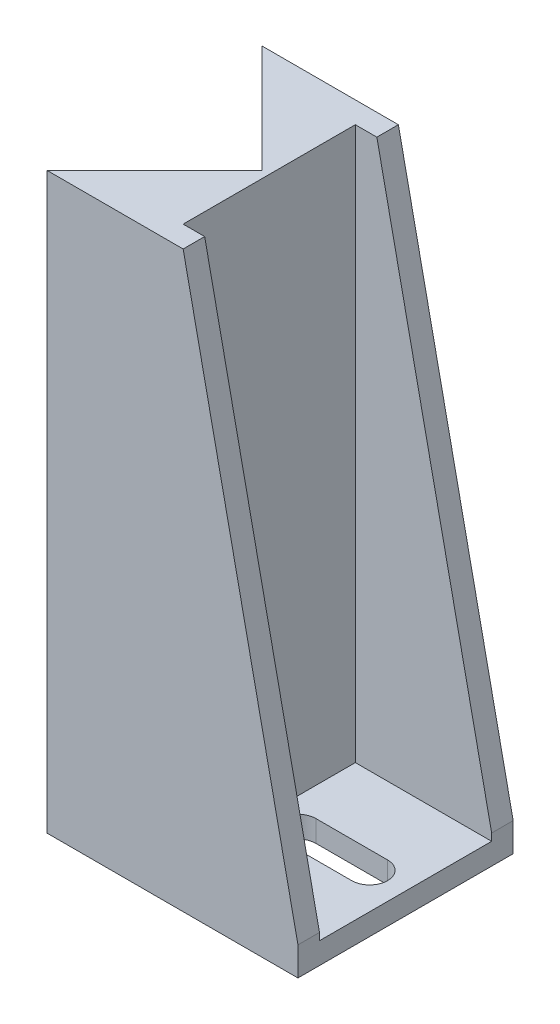
ISO-10303-21;
HEADER;
FILE_DESCRIPTION(('STEP AP214'),'2;1');
FILE_NAME('part.step','',(''),(''),'','','');
FILE_SCHEMA(('AUTOMOTIVE_DESIGN { 1 0 10303 214 1 1 1 1 }'));
ENDSEC;
DATA;
#1=APPLICATION_CONTEXT('core data for automotive mechanical design processes');
#2=APPLICATION_PROTOCOL_DEFINITION('international standard','automotive_design',2000,#1);
#3=PRODUCT_CONTEXT('',#1,'mechanical');
#4=PRODUCT('Part','Part','',(#3));
#5=PRODUCT_RELATED_PRODUCT_CATEGORY('part','',(#4));
#6=PRODUCT_DEFINITION_FORMATION('','',#4);
#7=PRODUCT_DEFINITION_CONTEXT('part definition',#1,'design');
#8=PRODUCT_DEFINITION('design','',#6,#7);
#9=PRODUCT_DEFINITION_SHAPE('','',#8);
#10=(LENGTH_UNIT() NAMED_UNIT(*) SI_UNIT(.MILLI.,.METRE.));
#11=(NAMED_UNIT(*) PLANE_ANGLE_UNIT() SI_UNIT($,.RADIAN.));
#12=(NAMED_UNIT(*) SI_UNIT($,.STERADIAN.) SOLID_ANGLE_UNIT());
#13=UNCERTAINTY_MEASURE_WITH_UNIT(LENGTH_MEASURE(1.E-05),#10,'distance_accuracy_value','');
#14=(GEOMETRIC_REPRESENTATION_CONTEXT(3) GLOBAL_UNCERTAINTY_ASSIGNED_CONTEXT((#13)) GLOBAL_UNIT_ASSIGNED_CONTEXT((#10,
#11,#12)) REPRESENTATION_CONTEXT('',''));
#15=CARTESIAN_POINT('',(0.,0.,0.));
#16=DIRECTION('',(0.,0.,1.));
#17=DIRECTION('',(1.,0.,0.));
#18=AXIS2_PLACEMENT_3D('',#15,#16,#17);
#19=CARTESIAN_POINT('',(-9.525,-26.9407683632074,9.525));
#20=DIRECTION('',(0.707106781186548,0.,-0.707106781186547));
#21=DIRECTION('',(-0.707106781186547,0.,-0.707106781186548));
#22=AXIS2_PLACEMENT_3D('',#19,#20,#21);
#23=PLANE('',#22);
#24=DIRECTION('',(0.707106781186547,0.,0.707106781186548));
#25=VECTOR('',#24,1.);
#26=CARTESIAN_POINT('',(-19.05,25.4,0.));
#27=LINE('',#26,#25);
#28=CARTESIAN_POINT('',(-19.05,25.4,0.));
#29=VERTEX_POINT('',#28);
#30=CARTESIAN_POINT('',(0.,25.4,19.05));
#31=VERTEX_POINT('',#30);
#32=EDGE_CURVE('E173',#29,#31,#27,.T.);
#33=ORIENTED_EDGE('',*,*,#32,.T.);
#34=DIRECTION('',(0.,1.,0.));
#35=VECTOR('',#34,1.);
#36=CARTESIAN_POINT('',(0.,-26.9407683632074,19.05));
#37=LINE('',#36,#35);
#38=CARTESIAN_POINT('',(0.,101.6,19.05));
#39=VERTEX_POINT('',#38);
#40=EDGE_CURVE('E207',#31,#39,#37,.T.);
#41=ORIENTED_EDGE('',*,*,#40,.T.);
#42=DIRECTION('',(-0.707106781186547,0.,-0.707106781186548));
#43=VECTOR('',#42,1.);
#44=CARTESIAN_POINT('',(-9.525,101.6,9.525));
#45=LINE('',#44,#43);
#46=CARTESIAN_POINT('',(-19.05,101.6,0.));
#47=VERTEX_POINT('',#46);
#48=EDGE_CURVE('E205',#39,#47,#45,.T.);
#49=ORIENTED_EDGE('',*,*,#48,.T.);
#50=DIRECTION('',(0.,1.,0.));
#51=VECTOR('',#50,1.);
#52=CARTESIAN_POINT('',(-19.05,-26.9407683632074,0.));
#53=LINE('',#52,#51);
#54=EDGE_CURVE('E50',#29,#47,#53,.T.);
#55=ORIENTED_EDGE('',*,*,#54,.F.);
#56=EDGE_LOOP('',(#33,#41,#49,#55));
#57=FACE_BOUND('',#56,.T.);
#58=ADVANCED_FACE('F35',(#57),#23,.F.);
#59=CARTESIAN_POINT('',(9.525,-26.9407683632074,9.525));
#60=DIRECTION('',(0.707106781186548,0.,0.707106781186547));
#61=DIRECTION('',(0.707106781186547,0.,-0.707106781186548));
#62=AXIS2_PLACEMENT_3D('',#59,#60,#61);
#63=PLANE('',#62);
#64=DIRECTION('',(-0.707106781186547,0.,0.707106781186547));
#65=VECTOR('',#64,1.);
#66=CARTESIAN_POINT('',(0.,25.4,19.05));
#67=LINE('',#66,#65);
#68=CARTESIAN_POINT('',(-19.05,25.4,38.1));
#69=VERTEX_POINT('',#68);
#70=EDGE_CURVE('E58',#31,#69,#67,.T.);
#71=ORIENTED_EDGE('',*,*,#70,.T.);
#72=DIRECTION('',(0.,1.,0.));
#73=VECTOR('',#72,1.);
#74=CARTESIAN_POINT('',(-19.05,-26.9407683632074,38.1));
#75=LINE('',#74,#73);
#76=CARTESIAN_POINT('',(-19.05,101.6,38.1));
#77=VERTEX_POINT('',#76);
#78=EDGE_CURVE('E154',#69,#77,#75,.T.);
#79=ORIENTED_EDGE('',*,*,#78,.T.);
#80=DIRECTION('',(0.707106781186547,0.,-0.707106781186548));
#81=VECTOR('',#80,1.);
#82=CARTESIAN_POINT('',(9.525,101.6,9.525));
#83=LINE('',#82,#81);
#84=EDGE_CURVE('E159',#77,#39,#83,.T.);
#85=ORIENTED_EDGE('',*,*,#84,.T.);
#86=ORIENTED_EDGE('',*,*,#40,.F.);
#87=EDGE_LOOP('',(#71,#79,#85,#86));
#88=FACE_BOUND('',#87,.T.);
#89=ADVANCED_FACE('F290',(#88),#63,.F.);
#90=CARTESIAN_POINT('',(25.4,5.08,38.1));
#91=DIRECTION('',(-0.978549784986749,-0.206010481049842,0.));
#92=DIRECTION('',(0.206010481049842,-0.978549784986749,0.));
#93=AXIS2_PLACEMENT_3D('',#90,#91,#92);
#94=PLANE('',#93);
#95=DIRECTION('',(0.,0.,-1.));
#96=VECTOR('',#95,1.);
#97=CARTESIAN_POINT('',(5.08,101.6,38.1));
#98=LINE('',#97,#96);
#99=CARTESIAN_POINT('',(5.08000000000001,101.6,3.81));
#100=VERTEX_POINT('',#99);
#101=CARTESIAN_POINT('',(5.08,101.6,0.));
#102=VERTEX_POINT('',#101);
#103=EDGE_CURVE('E254',#100,#102,#98,.T.);
#104=ORIENTED_EDGE('',*,*,#103,.F.);
#105=DIRECTION('',(-0.206010481049842,0.978549784986749,0.));
#106=VECTOR('',#105,1.);
#107=CARTESIAN_POINT('',(25.4,5.08,3.81));
#108=LINE('',#107,#106);
#109=CARTESIAN_POINT('',(25.4,5.08,3.81));
#110=VERTEX_POINT('',#109);
#111=EDGE_CURVE('E242',#110,#100,#108,.T.);
#112=ORIENTED_EDGE('',*,*,#111,.F.);
#113=DIRECTION('',(0.,0.,-1.));
#114=VECTOR('',#113,1.);
#115=CARTESIAN_POINT('',(25.4,5.08,38.1));
#116=LINE('',#115,#114);
#117=CARTESIAN_POINT('',(25.4,5.08,0.));
#118=VERTEX_POINT('',#117);
#119=EDGE_CURVE('E266',#110,#118,#116,.T.);
#120=ORIENTED_EDGE('',*,*,#119,.T.);
#121=DIRECTION('',(-0.206010481049842,0.978549784986749,0.));
#122=VECTOR('',#121,1.);
#123=CARTESIAN_POINT('',(25.4,5.08,0.));
#124=LINE('',#123,#122);
#125=EDGE_CURVE('E259',#118,#102,#124,.T.);
#126=ORIENTED_EDGE('',*,*,#125,.T.);
#127=EDGE_LOOP('',(#104,#112,#120,#126));
#128=FACE_BOUND('',#127,.T.);
#129=ADVANCED_FACE('F274',(#128),#94,.F.);
#130=CARTESIAN_POINT('',(0.,3.81,38.1));
#131=DIRECTION('',(0.,1.,0.));
#132=DIRECTION('',(0.,0.,1.));
#133=AXIS2_PLACEMENT_3D('',#130,#131,#132);
#134=PLANE('',#133);
#135=DIRECTION('',(1.,0.,0.));
#136=VECTOR('',#135,1.);
#137=CARTESIAN_POINT('',(0.,3.81,3.81));
#138=LINE('',#137,#136);
#139=CARTESIAN_POINT('',(1.27,3.81,3.81));
#140=VERTEX_POINT('',#139);
#141=CARTESIAN_POINT('',(25.4,3.81,3.81));
#142=VERTEX_POINT('',#141);
#143=EDGE_CURVE('E240',#140,#142,#138,.T.);
#144=ORIENTED_EDGE('',*,*,#143,.F.);
#145=DIRECTION('',(0.,0.,-1.));
#146=VECTOR('',#145,1.);
#147=CARTESIAN_POINT('',(1.27,3.81,3.81));
#148=LINE('',#147,#146);
#149=CARTESIAN_POINT('',(1.27000000000001,3.81,34.29));
#150=VERTEX_POINT('',#149);
#151=EDGE_CURVE('E181',#150,#140,#148,.T.);
#152=ORIENTED_EDGE('',*,*,#151,.F.);
#153=DIRECTION('',(1.,0.,0.));
#154=VECTOR('',#153,1.);
#155=CARTESIAN_POINT('',(0.,3.81,34.29));
#156=LINE('',#155,#154);
#157=CARTESIAN_POINT('',(25.4,3.81,34.29));
#158=VERTEX_POINT('',#157);
#159=EDGE_CURVE('E243',#150,#158,#156,.T.);
#160=ORIENTED_EDGE('',*,*,#159,.T.);
#161=DIRECTION('',(0.,0.,1.));
#162=VECTOR('',#161,1.);
#163=CARTESIAN_POINT('',(25.4,3.81,3.81));
#164=LINE('',#163,#162);
#165=EDGE_CURVE('E178',#142,#158,#164,.T.);
#166=ORIENTED_EDGE('',*,*,#165,.F.);
#167=EDGE_LOOP('',(#144,#152,#160,#166));
#168=FACE_BOUND('',#167,.T.);
#169=CARTESIAN_POINT('',(6.35,3.81,19.05));
#170=DIRECTION('',(0.,1.,0.));
#171=DIRECTION('',(0.,0.,1.));
#172=AXIS2_PLACEMENT_3D('',#169,#170,#171);
#173=CIRCLE('',#172,3.175);
#174=CARTESIAN_POINT('',(6.35,3.81,22.225));
#175=VERTEX_POINT('',#174);
#176=CARTESIAN_POINT('',(6.35,3.81,15.875));
#177=VERTEX_POINT('',#176);
#178=EDGE_CURVE('E225',#175,#177,#173,.F.);
#179=ORIENTED_EDGE('',*,*,#178,.T.);
#180=DIRECTION('',(1.,0.,0.));
#181=VECTOR('',#180,1.);
#182=CARTESIAN_POINT('',(6.35,3.81,15.875));
#183=LINE('',#182,#181);
#184=CARTESIAN_POINT('',(19.05,3.81,15.875));
#185=VERTEX_POINT('',#184);
#186=EDGE_CURVE('E213',#177,#185,#183,.T.);
#187=ORIENTED_EDGE('',*,*,#186,.T.);
#188=CARTESIAN_POINT('',(19.05,3.81,19.05));
#189=DIRECTION('',(0.,1.,0.));
#190=DIRECTION('',(0.,0.,1.));
#191=AXIS2_PLACEMENT_3D('',#188,#189,#190);
#192=CIRCLE('',#191,3.175);
#193=CARTESIAN_POINT('',(19.05,3.81,22.225));
#194=VERTEX_POINT('',#193);
#195=EDGE_CURVE('E233',#185,#194,#192,.F.);
#196=ORIENTED_EDGE('',*,*,#195,.T.);
#197=DIRECTION('',(-1.,0.,0.));
#198=VECTOR('',#197,1.);
#199=CARTESIAN_POINT('',(6.35,3.81,22.225));
#200=LINE('',#199,#198);
#201=EDGE_CURVE('E229',#194,#175,#200,.T.);
#202=ORIENTED_EDGE('',*,*,#201,.T.);
#203=EDGE_LOOP('',(#179,#187,#196,#202));
#204=FACE_BOUND('',#203,.T.);
#205=ADVANCED_FACE('F307',(#168,#204),#134,.T.);
#206=CARTESIAN_POINT('',(25.4,5.08,38.1));
#207=VERTEX_POINT('',#206);
#208=CARTESIAN_POINT('',(25.4,5.08,34.29));
#209=VERTEX_POINT('',#208);
#210=EDGE_CURVE('E43',#207,#209,#116,.T.);
#211=ORIENTED_EDGE('',*,*,#210,.T.);
#212=DIRECTION('',(-0.206010481049842,0.978549784986749,0.));
#213=VECTOR('',#212,1.);
#214=CARTESIAN_POINT('',(25.4,5.08,34.29));
#215=LINE('',#214,#213);
#216=CARTESIAN_POINT('',(5.08,101.6,34.29));
#217=VERTEX_POINT('',#216);
#218=EDGE_CURVE('E245',#209,#217,#215,.T.);
#219=ORIENTED_EDGE('',*,*,#218,.T.);
#220=CARTESIAN_POINT('',(5.08,101.6,38.1));
#221=VERTEX_POINT('',#220);
#222=EDGE_CURVE('E264',#221,#217,#98,.T.);
#223=ORIENTED_EDGE('',*,*,#222,.F.);
#224=DIRECTION('',(-0.206010481049842,0.978549784986749,0.));
#225=VECTOR('',#224,1.);
#226=CARTESIAN_POINT('',(25.4,5.08,38.1));
#227=LINE('',#226,#225);
#228=EDGE_CURVE('E250',#207,#221,#227,.T.);
#229=ORIENTED_EDGE('',*,*,#228,.F.);
#230=EDGE_LOOP('',(#211,#219,#223,#229));
#231=FACE_BOUND('',#230,.T.);
#232=ADVANCED_FACE('F294',(#231),#94,.F.);
#233=CARTESIAN_POINT('',(0.,0.,38.1));
#234=DIRECTION('',(0.,1.,0.));
#235=DIRECTION('',(0.,0.,1.));
#236=AXIS2_PLACEMENT_3D('',#233,#234,#235);
#237=PLANE('',#236);
#238=CARTESIAN_POINT('',(19.05,0.,19.05));
#239=DIRECTION('',(0.,-1.,0.));
#240=DIRECTION('',(0.,0.,-1.));
#241=AXIS2_PLACEMENT_3D('',#238,#239,#240);
#242=CIRCLE('',#241,3.175);
#243=CARTESIAN_POINT('',(19.05,0.,15.875));
#244=VERTEX_POINT('',#243);
#245=CARTESIAN_POINT('',(19.05,0.,22.225));
#246=VERTEX_POINT('',#245);
#247=EDGE_CURVE('E214',#244,#246,#242,.T.);
#248=ORIENTED_EDGE('',*,*,#247,.F.);
#249=DIRECTION('',(1.,0.,0.));
#250=VECTOR('',#249,1.);
#251=CARTESIAN_POINT('',(6.35,0.,15.875));
#252=LINE('',#251,#250);
#253=CARTESIAN_POINT('',(6.35,0.,15.875));
#254=VERTEX_POINT('',#253);
#255=EDGE_CURVE('E217',#254,#244,#252,.T.);
#256=ORIENTED_EDGE('',*,*,#255,.F.);
#257=CARTESIAN_POINT('',(6.35,0.,19.05));
#258=DIRECTION('',(0.,-1.,0.));
#259=DIRECTION('',(0.,0.,-1.));
#260=AXIS2_PLACEMENT_3D('',#257,#258,#259);
#261=CIRCLE('',#260,3.175);
#262=CARTESIAN_POINT('',(6.35,0.,22.225));
#263=VERTEX_POINT('',#262);
#264=EDGE_CURVE('E209',#263,#254,#261,.T.);
#265=ORIENTED_EDGE('',*,*,#264,.F.);
#266=DIRECTION('',(-1.,0.,0.));
#267=VECTOR('',#266,1.);
#268=CARTESIAN_POINT('',(6.35,0.,22.225));
#269=LINE('',#268,#267);
#270=EDGE_CURVE('E211',#246,#263,#269,.T.);
#271=ORIENTED_EDGE('',*,*,#270,.F.);
#272=EDGE_LOOP('',(#248,#256,#265,#271));
#273=FACE_BOUND('',#272,.T.);
#274=DIRECTION('',(1.,0.,0.));
#275=VECTOR('',#274,1.);
#276=CARTESIAN_POINT('',(0.,0.,0.));
#277=LINE('',#276,#275);
#278=CARTESIAN_POINT('',(-19.05,0.,0.));
#279=VERTEX_POINT('',#278);
#280=CARTESIAN_POINT('',(25.4,0.,0.));
#281=VERTEX_POINT('',#280);
#282=EDGE_CURVE('E247',#279,#281,#277,.T.);
#283=ORIENTED_EDGE('',*,*,#282,.T.);
#284=DIRECTION('',(0.,0.,-1.));
#285=VECTOR('',#284,1.);
#286=CARTESIAN_POINT('',(25.4,0.,38.1));
#287=LINE('',#286,#285);
#288=CARTESIAN_POINT('',(25.4,0.,38.1));
#289=VERTEX_POINT('',#288);
#290=EDGE_CURVE('E11',#289,#281,#287,.T.);
#291=ORIENTED_EDGE('',*,*,#290,.F.);
#292=DIRECTION('',(1.,0.,0.));
#293=VECTOR('',#292,1.);
#294=CARTESIAN_POINT('',(0.,0.,38.1));
#295=LINE('',#294,#293);
#296=CARTESIAN_POINT('',(-19.05,0.,38.1));
#297=VERTEX_POINT('',#296);
#298=EDGE_CURVE('E152',#297,#289,#295,.T.);
#299=ORIENTED_EDGE('',*,*,#298,.F.);
#300=DIRECTION('',(0.,0.,-1.));
#301=VECTOR('',#300,1.);
#302=CARTESIAN_POINT('',(-19.05,0.,38.1));
#303=LINE('',#302,#301);
#304=EDGE_CURVE('E163',#297,#279,#303,.T.);
#305=ORIENTED_EDGE('',*,*,#304,.T.);
#306=EDGE_LOOP('',(#283,#291,#299,#305));
#307=FACE_BOUND('',#306,.T.);
#308=ADVANCED_FACE('F37',(#273,#307),#237,.F.);
#309=CARTESIAN_POINT('',(25.4,0.,38.1));
#310=DIRECTION('',(-1.,0.,0.));
#311=DIRECTION('',(0.,0.,1.));
#312=AXIS2_PLACEMENT_3D('',#309,#310,#311);
#313=PLANE('',#312);
#314=ORIENTED_EDGE('',*,*,#119,.F.);
#315=DIRECTION('',(0.,1.,0.));
#316=VECTOR('',#315,1.);
#317=CARTESIAN_POINT('',(25.4,-35.0652787771354,3.81));
#318=LINE('',#317,#316);
#319=EDGE_CURVE('E182',#142,#110,#318,.T.);
#320=ORIENTED_EDGE('',*,*,#319,.F.);
#321=ORIENTED_EDGE('',*,*,#165,.T.);
#322=DIRECTION('',(0.,1.,0.));
#323=VECTOR('',#322,1.);
#324=CARTESIAN_POINT('',(25.4,-35.0652787771354,34.29));
#325=LINE('',#324,#323);
#326=EDGE_CURVE('E194',#158,#209,#325,.T.);
#327=ORIENTED_EDGE('',*,*,#326,.T.);
#328=ORIENTED_EDGE('',*,*,#210,.F.);
#329=DIRECTION('',(0.,1.,0.));
#330=VECTOR('',#329,1.);
#331=CARTESIAN_POINT('',(25.4,0.,38.1));
#332=LINE('',#331,#330);
#333=EDGE_CURVE('E165',#289,#207,#332,.T.);
#334=ORIENTED_EDGE('',*,*,#333,.F.);
#335=ORIENTED_EDGE('',*,*,#290,.T.);
#336=DIRECTION('',(0.,1.,0.));
#337=VECTOR('',#336,1.);
#338=CARTESIAN_POINT('',(25.4,0.,0.));
#339=LINE('',#338,#337);
#340=EDGE_CURVE('E256',#281,#118,#339,.T.);
#341=ORIENTED_EDGE('',*,*,#340,.T.);
#342=EDGE_LOOP('',(#314,#320,#321,#327,#328,#334,#335,#341));
#343=FACE_BOUND('',#342,.T.);
#344=ADVANCED_FACE('F280',(#343),#313,.F.);
#345=CARTESIAN_POINT('',(5.08,101.6,38.1));
#346=DIRECTION('',(0.,-1.,0.));
#347=DIRECTION('',(0.,0.,-1.));
#348=AXIS2_PLACEMENT_3D('',#345,#346,#347);
#349=PLANE('',#348);
#350=DIRECTION('',(0.,0.,1.));
#351=VECTOR('',#350,1.);
#352=CARTESIAN_POINT('',(1.27,101.6,3.81));
#353=LINE('',#352,#351);
#354=CARTESIAN_POINT('',(1.27,101.6,3.81));
#355=VERTEX_POINT('',#354);
#356=CARTESIAN_POINT('',(1.27000000000001,101.6,34.29));
#357=VERTEX_POINT('',#356);
#358=EDGE_CURVE('E185',#355,#357,#353,.T.);
#359=ORIENTED_EDGE('',*,*,#358,.F.);
#360=DIRECTION('',(-1.,0.,0.));
#361=VECTOR('',#360,1.);
#362=CARTESIAN_POINT('',(25.4,101.6,3.81));
#363=LINE('',#362,#361);
#364=EDGE_CURVE('E183',#100,#355,#363,.T.);
#365=ORIENTED_EDGE('',*,*,#364,.F.);
#366=ORIENTED_EDGE('',*,*,#103,.T.);
#367=DIRECTION('',(-1.,0.,0.));
#368=VECTOR('',#367,1.);
#369=CARTESIAN_POINT('',(5.08,101.6,0.));
#370=LINE('',#369,#368);
#371=EDGE_CURVE('E166',#102,#47,#370,.T.);
#372=ORIENTED_EDGE('',*,*,#371,.T.);
#373=ORIENTED_EDGE('',*,*,#48,.F.);
#374=ORIENTED_EDGE('',*,*,#84,.F.);
#375=DIRECTION('',(-1.,0.,0.));
#376=VECTOR('',#375,1.);
#377=CARTESIAN_POINT('',(5.08,101.6,38.1));
#378=LINE('',#377,#376);
#379=EDGE_CURVE('E252',#221,#77,#378,.T.);
#380=ORIENTED_EDGE('',*,*,#379,.F.);
#381=ORIENTED_EDGE('',*,*,#222,.T.);
#382=DIRECTION('',(1.,0.,0.));
#383=VECTOR('',#382,1.);
#384=CARTESIAN_POINT('',(25.4,101.6,34.29));
#385=LINE('',#384,#383);
#386=EDGE_CURVE('E188',#357,#217,#385,.T.);
#387=ORIENTED_EDGE('',*,*,#386,.F.);
#388=EDGE_LOOP('',(#359,#365,#366,#372,#373,#374,#380,#381,#387));
#389=FACE_BOUND('',#388,.T.);
#390=ADVANCED_FACE('F286',(#389),#349,.F.);
#391=CARTESIAN_POINT('',(0.,0.,38.1));
#392=DIRECTION('',(0.,0.,1.));
#393=DIRECTION('',(1.,0.,0.));
#394=AXIS2_PLACEMENT_3D('',#391,#392,#393);
#395=PLANE('',#394);
#396=ORIENTED_EDGE('',*,*,#379,.T.);
#397=ORIENTED_EDGE('',*,*,#78,.F.);
#398=EDGE_CURVE('E148',#297,#69,#75,.T.);
#399=ORIENTED_EDGE('',*,*,#398,.F.);
#400=ORIENTED_EDGE('',*,*,#298,.T.);
#401=ORIENTED_EDGE('',*,*,#333,.T.);
#402=ORIENTED_EDGE('',*,*,#228,.T.);
#403=EDGE_LOOP('',(#396,#397,#399,#400,#401,#402));
#404=FACE_BOUND('',#403,.T.);
#405=ADVANCED_FACE('F151',(#404),#395,.T.);
#406=CARTESIAN_POINT('',(0.,0.,0.));
#407=DIRECTION('',(0.,0.,1.));
#408=DIRECTION('',(1.,0.,0.));
#409=AXIS2_PLACEMENT_3D('',#406,#407,#408);
#410=PLANE('',#409);
#411=ORIENTED_EDGE('',*,*,#282,.F.);
#412=EDGE_CURVE('E170',#279,#29,#53,.T.);
#413=ORIENTED_EDGE('',*,*,#412,.T.);
#414=ORIENTED_EDGE('',*,*,#54,.T.);
#415=ORIENTED_EDGE('',*,*,#371,.F.);
#416=ORIENTED_EDGE('',*,*,#125,.F.);
#417=ORIENTED_EDGE('',*,*,#340,.F.);
#418=EDGE_LOOP('',(#411,#413,#414,#415,#416,#417));
#419=FACE_BOUND('',#418,.T.);
#420=ADVANCED_FACE('F282',(#419),#410,.F.);
#421=CARTESIAN_POINT('',(0.,0.,34.29));
#422=DIRECTION('',(0.,0.,1.));
#423=DIRECTION('',(1.,0.,0.));
#424=AXIS2_PLACEMENT_3D('',#421,#422,#423);
#425=PLANE('',#424);
#426=ORIENTED_EDGE('',*,*,#159,.F.);
#427=DIRECTION('',(0.,1.,0.));
#428=VECTOR('',#427,1.);
#429=CARTESIAN_POINT('',(1.27000000000001,-35.0652787771354,34.29));
#430=LINE('',#429,#428);
#431=EDGE_CURVE('E197',#150,#357,#430,.T.);
#432=ORIENTED_EDGE('',*,*,#431,.T.);
#433=ORIENTED_EDGE('',*,*,#386,.T.);
#434=ORIENTED_EDGE('',*,*,#218,.F.);
#435=ORIENTED_EDGE('',*,*,#326,.F.);
#436=EDGE_LOOP('',(#426,#432,#433,#434,#435));
#437=FACE_BOUND('',#436,.T.);
#438=ADVANCED_FACE('F297',(#437),#425,.F.);
#439=CARTESIAN_POINT('',(0.,0.,3.81));
#440=DIRECTION('',(0.,0.,1.));
#441=DIRECTION('',(1.,0.,0.));
#442=AXIS2_PLACEMENT_3D('',#439,#440,#441);
#443=PLANE('',#442);
#444=DIRECTION('',(0.,1.,0.));
#445=VECTOR('',#444,1.);
#446=CARTESIAN_POINT('',(1.27,-35.0652787771354,3.81));
#447=LINE('',#446,#445);
#448=EDGE_CURVE('E191',#140,#355,#447,.T.);
#449=ORIENTED_EDGE('',*,*,#448,.F.);
#450=ORIENTED_EDGE('',*,*,#143,.T.);
#451=ORIENTED_EDGE('',*,*,#319,.T.);
#452=ORIENTED_EDGE('',*,*,#111,.T.);
#453=ORIENTED_EDGE('',*,*,#364,.T.);
#454=EDGE_LOOP('',(#449,#450,#451,#452,#453));
#455=FACE_BOUND('',#454,.T.);
#456=ADVANCED_FACE('F304',(#455),#443,.T.);
#457=CARTESIAN_POINT('',(6.35,23.8904631420692,15.875));
#458=DIRECTION('',(0.,0.,-1.));
#459=DIRECTION('',(-1.,0.,0.));
#460=AXIS2_PLACEMENT_3D('',#457,#458,#459);
#461=PLANE('',#460);
#462=DIRECTION('',(0.,-1.,0.));
#463=VECTOR('',#462,1.);
#464=CARTESIAN_POINT('',(6.35,23.8904631420692,15.875));
#465=LINE('',#464,#463);
#466=EDGE_CURVE('E227',#177,#254,#465,.T.);
#467=ORIENTED_EDGE('',*,*,#466,.T.);
#468=ORIENTED_EDGE('',*,*,#255,.T.);
#469=DIRECTION('',(0.,-1.,0.));
#470=VECTOR('',#469,1.);
#471=CARTESIAN_POINT('',(19.05,23.8904631420692,15.875));
#472=LINE('',#471,#470);
#473=EDGE_CURVE('E224',#185,#244,#472,.T.);
#474=ORIENTED_EDGE('',*,*,#473,.F.);
#475=ORIENTED_EDGE('',*,*,#186,.F.);
#476=EDGE_LOOP('',(#467,#468,#474,#475));
#477=FACE_BOUND('',#476,.T.);
#478=ADVANCED_FACE('F317',(#477),#461,.F.);
#479=CARTESIAN_POINT('',(19.05,23.8904631420692,19.05));
#480=DIRECTION('',(0.,-1.,0.));
#481=DIRECTION('',(0.,0.,-1.));
#482=AXIS2_PLACEMENT_3D('',#479,#480,#481);
#483=CYLINDRICAL_SURFACE('',#482,3.175);
#484=ORIENTED_EDGE('',*,*,#473,.T.);
#485=ORIENTED_EDGE('',*,*,#247,.T.);
#486=DIRECTION('',(0.,-1.,0.));
#487=VECTOR('',#486,1.);
#488=CARTESIAN_POINT('',(19.05,23.8904631420692,22.225));
#489=LINE('',#488,#487);
#490=EDGE_CURVE('E232',#194,#246,#489,.T.);
#491=ORIENTED_EDGE('',*,*,#490,.F.);
#492=ORIENTED_EDGE('',*,*,#195,.F.);
#493=EDGE_LOOP('',(#484,#485,#491,#492));
#494=FACE_BOUND('',#493,.T.);
#495=ADVANCED_FACE('F327',(#494),#483,.F.);
#496=CARTESIAN_POINT('',(6.35,23.8904631420692,22.225));
#497=DIRECTION('',(0.,0.,1.));
#498=DIRECTION('',(1.,0.,0.));
#499=AXIS2_PLACEMENT_3D('',#496,#497,#498);
#500=PLANE('',#499);
#501=ORIENTED_EDGE('',*,*,#490,.T.);
#502=ORIENTED_EDGE('',*,*,#270,.T.);
#503=DIRECTION('',(0.,-1.,0.));
#504=VECTOR('',#503,1.);
#505=CARTESIAN_POINT('',(6.35,23.8904631420692,22.225));
#506=LINE('',#505,#504);
#507=EDGE_CURVE('E228',#175,#263,#506,.T.);
#508=ORIENTED_EDGE('',*,*,#507,.F.);
#509=ORIENTED_EDGE('',*,*,#201,.F.);
#510=EDGE_LOOP('',(#501,#502,#508,#509));
#511=FACE_BOUND('',#510,.T.);
#512=ADVANCED_FACE('F329',(#511),#500,.F.);
#513=CARTESIAN_POINT('',(6.35,23.8904631420692,19.05));
#514=DIRECTION('',(0.,-1.,0.));
#515=DIRECTION('',(0.,0.,-1.));
#516=AXIS2_PLACEMENT_3D('',#513,#514,#515);
#517=CYLINDRICAL_SURFACE('',#516,3.175);
#518=ORIENTED_EDGE('',*,*,#507,.T.);
#519=ORIENTED_EDGE('',*,*,#264,.T.);
#520=ORIENTED_EDGE('',*,*,#466,.F.);
#521=ORIENTED_EDGE('',*,*,#178,.F.);
#522=EDGE_LOOP('',(#518,#519,#520,#521));
#523=FACE_BOUND('',#522,.T.);
#524=ADVANCED_FACE('F319',(#523),#517,.F.);
#525=CARTESIAN_POINT('',(1.27,-35.0652787771354,3.81));
#526=DIRECTION('',(-1.,0.,0.));
#527=DIRECTION('',(0.,0.,1.));
#528=AXIS2_PLACEMENT_3D('',#525,#526,#527);
#529=PLANE('',#528);
#530=ORIENTED_EDGE('',*,*,#151,.T.);
#531=ORIENTED_EDGE('',*,*,#448,.T.);
#532=ORIENTED_EDGE('',*,*,#358,.T.);
#533=ORIENTED_EDGE('',*,*,#431,.F.);
#534=EDGE_LOOP('',(#530,#531,#532,#533));
#535=FACE_BOUND('',#534,.T.);
#536=ADVANCED_FACE('F300',(#535),#529,.F.);
#537=CARTESIAN_POINT('',(-19.05,25.4,38.1));
#538=DIRECTION('',(-1.,0.,0.));
#539=DIRECTION('',(0.,0.,1.));
#540=AXIS2_PLACEMENT_3D('',#537,#538,#539);
#541=PLANE('',#540);
#542=ORIENTED_EDGE('',*,*,#304,.F.);
#543=ORIENTED_EDGE('',*,*,#398,.T.);
#544=DIRECTION('',(0.,0.,-1.));
#545=VECTOR('',#544,1.);
#546=CARTESIAN_POINT('',(-19.05,25.4,38.1));
#547=LINE('',#546,#545);
#548=EDGE_CURVE('E171',#69,#29,#547,.T.);
#549=ORIENTED_EDGE('',*,*,#548,.T.);
#550=ORIENTED_EDGE('',*,*,#412,.F.);
#551=EDGE_LOOP('',(#542,#543,#549,#550));
#552=FACE_BOUND('',#551,.T.);
#553=ADVANCED_FACE('F169',(#552),#541,.T.);
#554=CARTESIAN_POINT('',(0.,25.4,0.));
#555=DIRECTION('',(0.,-1.,0.));
#556=DIRECTION('',(0.,0.,-1.));
#557=AXIS2_PLACEMENT_3D('',#554,#555,#556);
#558=PLANE('',#557);
#559=ORIENTED_EDGE('',*,*,#548,.F.);
#560=ORIENTED_EDGE('',*,*,#70,.F.);
#561=ORIENTED_EDGE('',*,*,#32,.F.);
#562=EDGE_LOOP('',(#559,#560,#561));
#563=FACE_BOUND('',#562,.T.);
#564=ADVANCED_FACE('F349',(#563),#558,.F.);
#565=CLOSED_SHELL('',(#58,#89,#129,#205,#232,#308,#344,#390,#405,#420,#438,#456,#478,#495,#512,
#524,#536,#553,#564));
#566=MANIFOLD_SOLID_BREP('B2',#565);
#567=ADVANCED_BREP_SHAPE_REPRESENTATION('',(#18,#566),#14);
#568=SHAPE_DEFINITION_REPRESENTATION(#9,#567);
ENDSEC;
END-ISO-10303-21;
